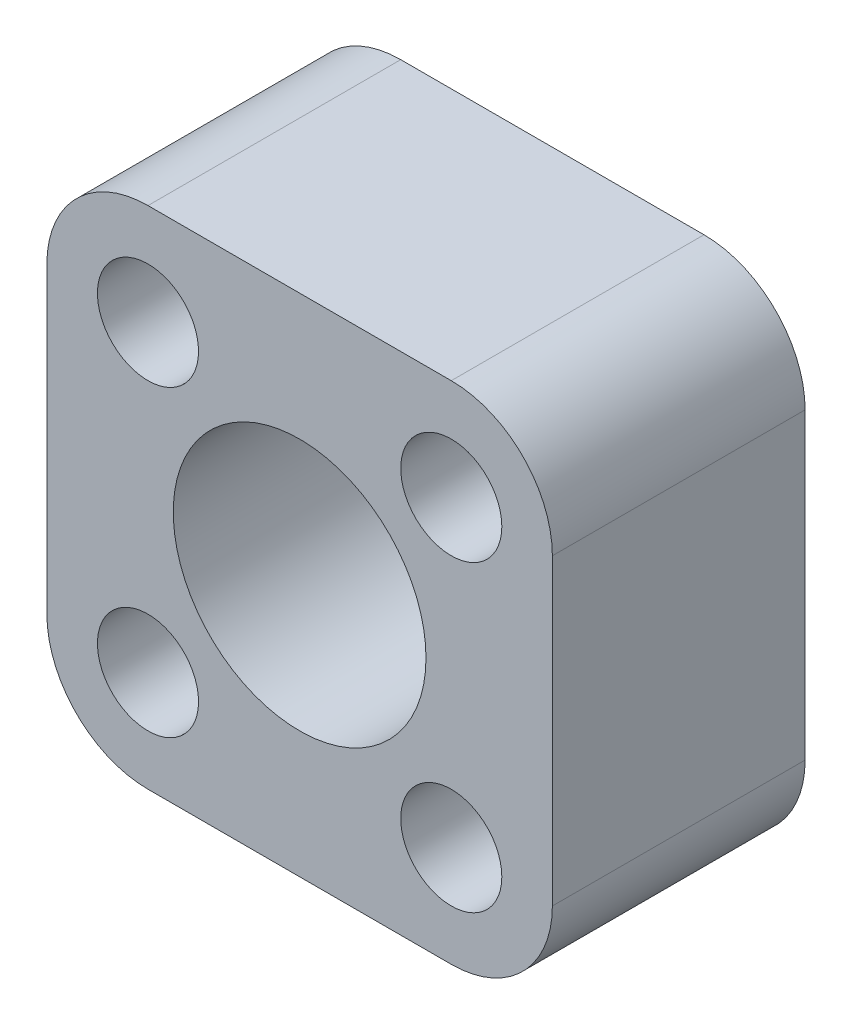
ISO-10303-21;
HEADER;
FILE_DESCRIPTION(('STEP AP214'),'2;1');
FILE_NAME('part.step','',(''),(''),'','','');
FILE_SCHEMA(('AUTOMOTIVE_DESIGN { 1 0 10303 214 1 1 1 1 }'));
ENDSEC;
DATA;
#1=APPLICATION_CONTEXT('core data for automotive mechanical design processes');
#2=APPLICATION_PROTOCOL_DEFINITION('international standard','automotive_design',2000,#1);
#3=PRODUCT_CONTEXT('',#1,'mechanical');
#4=PRODUCT('Part','Part','',(#3));
#5=PRODUCT_RELATED_PRODUCT_CATEGORY('part','',(#4));
#6=PRODUCT_DEFINITION_FORMATION('','',#4);
#7=PRODUCT_DEFINITION_CONTEXT('part definition',#1,'design');
#8=PRODUCT_DEFINITION('design','',#6,#7);
#9=PRODUCT_DEFINITION_SHAPE('','',#8);
#10=(LENGTH_UNIT() NAMED_UNIT(*) SI_UNIT(.MILLI.,.METRE.));
#11=(NAMED_UNIT(*) PLANE_ANGLE_UNIT() SI_UNIT($,.RADIAN.));
#12=(NAMED_UNIT(*) SI_UNIT($,.STERADIAN.) SOLID_ANGLE_UNIT());
#13=UNCERTAINTY_MEASURE_WITH_UNIT(LENGTH_MEASURE(1.E-05),#10,'distance_accuracy_value','');
#14=(GEOMETRIC_REPRESENTATION_CONTEXT(3) GLOBAL_UNCERTAINTY_ASSIGNED_CONTEXT((#13)) GLOBAL_UNIT_ASSIGNED_CONTEXT((#10,
#11,#12)) REPRESENTATION_CONTEXT('',''));
#15=CARTESIAN_POINT('',(0.,0.,0.));
#16=DIRECTION('',(0.,0.,1.));
#17=DIRECTION('',(1.,0.,0.));
#18=AXIS2_PLACEMENT_3D('',#15,#16,#17);
#19=CARTESIAN_POINT('',(3.,3.,5.));
#20=DIRECTION('',(0.,0.,-1.));
#21=DIRECTION('',(-1.,0.,0.));
#22=AXIS2_PLACEMENT_3D('',#19,#20,#21);
#23=PLANE('',#22);
#24=CARTESIAN_POINT('',(3.,3.,5.));
#25=DIRECTION('',(0.,0.,1.));
#26=DIRECTION('',(-1.,0.,0.));
#27=AXIS2_PLACEMENT_3D('',#24,#25,#26);
#28=CIRCLE('',#27,2.);
#29=CARTESIAN_POINT('',(5.,2.99999999999999,5.));
#30=VERTEX_POINT('',#29);
#31=CARTESIAN_POINT('',(2.99999999999999,5.,5.));
#32=VERTEX_POINT('',#31);
#33=EDGE_CURVE('E145',#30,#32,#28,.T.);
#34=ORIENTED_EDGE('',*,*,#33,.T.);
#35=DIRECTION('',(-1.,0.,0.));
#36=VECTOR('',#35,1.);
#37=CARTESIAN_POINT('',(-2.99999999999998,5.,5.));
#38=LINE('',#37,#36);
#39=CARTESIAN_POINT('',(-2.99999999999998,5.,5.));
#40=VERTEX_POINT('',#39);
#41=EDGE_CURVE('E93',#32,#40,#38,.T.);
#42=ORIENTED_EDGE('',*,*,#41,.T.);
#43=CARTESIAN_POINT('',(-3.,3.,5.));
#44=DIRECTION('',(0.,0.,1.));
#45=DIRECTION('',(1.,0.,0.));
#46=AXIS2_PLACEMENT_3D('',#43,#44,#45);
#47=CIRCLE('',#46,2.);
#48=CARTESIAN_POINT('',(-5.,2.99999999999999,5.));
#49=VERTEX_POINT('',#48);
#50=EDGE_CURVE('E160',#40,#49,#47,.T.);
#51=ORIENTED_EDGE('',*,*,#50,.T.);
#52=DIRECTION('',(0.,-1.,0.));
#53=VECTOR('',#52,1.);
#54=CARTESIAN_POINT('',(-5.,2.99999999999998,5.));
#55=LINE('',#54,#53);
#56=CARTESIAN_POINT('',(-5.,-2.99999999999999,5.));
#57=VERTEX_POINT('',#56);
#58=EDGE_CURVE('E173',#49,#57,#55,.T.);
#59=ORIENTED_EDGE('',*,*,#58,.T.);
#60=CARTESIAN_POINT('',(-3.,-3.,5.));
#61=DIRECTION('',(0.,0.,1.));
#62=DIRECTION('',(1.,0.,0.));
#63=AXIS2_PLACEMENT_3D('',#60,#61,#62);
#64=CIRCLE('',#63,2.);
#65=CARTESIAN_POINT('',(-2.99999999999998,-5.,5.));
#66=VERTEX_POINT('',#65);
#67=EDGE_CURVE('E112',#57,#66,#64,.T.);
#68=ORIENTED_EDGE('',*,*,#67,.T.);
#69=DIRECTION('',(1.,0.,0.));
#70=VECTOR('',#69,1.);
#71=CARTESIAN_POINT('',(-2.99999999999998,-5.,5.));
#72=LINE('',#71,#70);
#73=CARTESIAN_POINT('',(2.99999999999999,-5.,5.));
#74=VERTEX_POINT('',#73);
#75=EDGE_CURVE('E106',#66,#74,#72,.T.);
#76=ORIENTED_EDGE('',*,*,#75,.T.);
#77=CARTESIAN_POINT('',(3.,-3.,5.));
#78=DIRECTION('',(0.,0.,1.));
#79=DIRECTION('',(1.,0.,0.));
#80=AXIS2_PLACEMENT_3D('',#77,#78,#79);
#81=CIRCLE('',#80,2.);
#82=CARTESIAN_POINT('',(5.,-3.,5.));
#83=VERTEX_POINT('',#82);
#84=EDGE_CURVE('E110',#74,#83,#81,.T.);
#85=ORIENTED_EDGE('',*,*,#84,.T.);
#86=DIRECTION('',(0.,1.,0.));
#87=VECTOR('',#86,1.);
#88=CARTESIAN_POINT('',(5.,2.99999999999999,5.));
#89=LINE('',#88,#87);
#90=EDGE_CURVE('E50',#83,#30,#89,.T.);
#91=ORIENTED_EDGE('',*,*,#90,.T.);
#92=EDGE_LOOP('',(#34,#42,#51,#59,#68,#76,#85,#91));
#93=FACE_BOUND('',#92,.T.);
#94=CARTESIAN_POINT('',(-3.,3.,5.));
#95=DIRECTION('',(0.,0.,1.));
#96=DIRECTION('',(1.,0.,0.));
#97=AXIS2_PLACEMENT_3D('',#94,#95,#96);
#98=CIRCLE('',#97,1.);
#99=CARTESIAN_POINT('',(-2.,3.,5.));
#100=VERTEX_POINT('',#99);
#101=EDGE_CURVE('E134',#100,#100,#98,.T.);
#102=ORIENTED_EDGE('',*,*,#101,.F.);
#103=EDGE_LOOP('',(#102));
#104=FACE_BOUND('',#103,.T.);
#105=CARTESIAN_POINT('',(0.,0.,5.));
#106=DIRECTION('',(0.,0.,1.));
#107=DIRECTION('',(1.,0.,0.));
#108=AXIS2_PLACEMENT_3D('',#105,#106,#107);
#109=CIRCLE('',#108,2.5);
#110=CARTESIAN_POINT('',(2.5,0.,5.));
#111=VERTEX_POINT('',#110);
#112=EDGE_CURVE('E182',#111,#111,#109,.T.);
#113=ORIENTED_EDGE('',*,*,#112,.F.);
#114=EDGE_LOOP('',(#113));
#115=FACE_BOUND('',#114,.T.);
#116=CARTESIAN_POINT('',(3.,3.00000000000017,5.));
#117=DIRECTION('',(0.,0.,1.));
#118=DIRECTION('',(1.,0.,0.));
#119=AXIS2_PLACEMENT_3D('',#116,#117,#118);
#120=CIRCLE('',#119,1.00000000000017);
#121=CARTESIAN_POINT('',(4.00000000000017,3.00000000000017,5.));
#122=VERTEX_POINT('',#121);
#123=EDGE_CURVE('E188',#122,#122,#120,.T.);
#124=ORIENTED_EDGE('',*,*,#123,.F.);
#125=EDGE_LOOP('',(#124));
#126=FACE_BOUND('',#125,.T.);
#127=CARTESIAN_POINT('',(3.00000000000017,-2.99999999999983,5.));
#128=DIRECTION('',(0.,0.,1.));
#129=DIRECTION('',(1.,0.,0.));
#130=AXIS2_PLACEMENT_3D('',#127,#128,#129);
#131=CIRCLE('',#130,1.00000000000024);
#132=CARTESIAN_POINT('',(4.00000000000041,-2.99999999999983,5.));
#133=VERTEX_POINT('',#132);
#134=EDGE_CURVE('E194',#133,#133,#131,.T.);
#135=ORIENTED_EDGE('',*,*,#134,.F.);
#136=EDGE_LOOP('',(#135));
#137=FACE_BOUND('',#136,.T.);
#138=CARTESIAN_POINT('',(-2.99999999999983,-3.,5.));
#139=DIRECTION('',(0.,0.,1.));
#140=DIRECTION('',(1.,0.,0.));
#141=AXIS2_PLACEMENT_3D('',#138,#139,#140);
#142=CIRCLE('',#141,1.00000000000009);
#143=CARTESIAN_POINT('',(-1.99999999999974,-3.,5.));
#144=VERTEX_POINT('',#143);
#145=EDGE_CURVE('E200',#144,#144,#142,.T.);
#146=ORIENTED_EDGE('',*,*,#145,.F.);
#147=EDGE_LOOP('',(#146));
#148=FACE_BOUND('',#147,.T.);
#149=ADVANCED_FACE('F33',(#93,#104,#115,#126,#137,#148),#23,.F.);
#150=CARTESIAN_POINT('',(3.,3.,0.));
#151=DIRECTION('',(0.,0.,-1.));
#152=DIRECTION('',(-1.,0.,0.));
#153=AXIS2_PLACEMENT_3D('',#150,#151,#152);
#154=PLANE('',#153);
#155=CARTESIAN_POINT('',(3.00000000000017,-2.99999999999983,0.));
#156=DIRECTION('',(0.,0.,1.));
#157=DIRECTION('',(1.,0.,0.));
#158=AXIS2_PLACEMENT_3D('',#155,#156,#157);
#159=CIRCLE('',#158,1.00000000000024);
#160=CARTESIAN_POINT('',(4.00000000000041,-2.99999999999983,0.));
#161=VERTEX_POINT('',#160);
#162=EDGE_CURVE('E197',#161,#161,#159,.T.);
#163=ORIENTED_EDGE('',*,*,#162,.T.);
#164=EDGE_LOOP('',(#163));
#165=FACE_BOUND('',#164,.T.);
#166=CARTESIAN_POINT('',(0.,0.,0.));
#167=DIRECTION('',(0.,0.,1.));
#168=DIRECTION('',(1.,0.,0.));
#169=AXIS2_PLACEMENT_3D('',#166,#167,#168);
#170=CIRCLE('',#169,2.5);
#171=CARTESIAN_POINT('',(2.5,0.,0.));
#172=VERTEX_POINT('',#171);
#173=EDGE_CURVE('E185',#172,#172,#170,.T.);
#174=ORIENTED_EDGE('',*,*,#173,.T.);
#175=EDGE_LOOP('',(#174));
#176=FACE_BOUND('',#175,.T.);
#177=CARTESIAN_POINT('',(3.,3.,0.));
#178=DIRECTION('',(0.,0.,1.));
#179=DIRECTION('',(-1.,0.,0.));
#180=AXIS2_PLACEMENT_3D('',#177,#178,#179);
#181=CIRCLE('',#180,2.);
#182=CARTESIAN_POINT('',(5.,2.99999999999999,0.));
#183=VERTEX_POINT('',#182);
#184=CARTESIAN_POINT('',(2.99999999999999,5.,0.));
#185=VERTEX_POINT('',#184);
#186=EDGE_CURVE('E130',#183,#185,#181,.T.);
#187=ORIENTED_EDGE('',*,*,#186,.F.);
#188=DIRECTION('',(0.,1.,0.));
#189=VECTOR('',#188,1.);
#190=CARTESIAN_POINT('',(5.,2.99999999999999,0.));
#191=LINE('',#190,#189);
#192=CARTESIAN_POINT('',(5.,-3.,0.));
#193=VERTEX_POINT('',#192);
#194=EDGE_CURVE('E85',#193,#183,#191,.T.);
#195=ORIENTED_EDGE('',*,*,#194,.F.);
#196=CARTESIAN_POINT('',(3.,-3.,0.));
#197=DIRECTION('',(0.,0.,1.));
#198=DIRECTION('',(1.,0.,0.));
#199=AXIS2_PLACEMENT_3D('',#196,#197,#198);
#200=CIRCLE('',#199,2.);
#201=CARTESIAN_POINT('',(2.99999999999999,-5.,0.));
#202=VERTEX_POINT('',#201);
#203=EDGE_CURVE('E79',#202,#193,#200,.T.);
#204=ORIENTED_EDGE('',*,*,#203,.F.);
#205=DIRECTION('',(1.,0.,0.));
#206=VECTOR('',#205,1.);
#207=CARTESIAN_POINT('',(-2.99999999999998,-5.,0.));
#208=LINE('',#207,#206);
#209=CARTESIAN_POINT('',(-2.99999999999998,-5.,0.));
#210=VERTEX_POINT('',#209);
#211=EDGE_CURVE('E120',#210,#202,#208,.T.);
#212=ORIENTED_EDGE('',*,*,#211,.F.);
#213=CARTESIAN_POINT('',(-3.,-3.,0.));
#214=DIRECTION('',(0.,0.,1.));
#215=DIRECTION('',(1.,0.,0.));
#216=AXIS2_PLACEMENT_3D('',#213,#214,#215);
#217=CIRCLE('',#216,2.);
#218=CARTESIAN_POINT('',(-5.,-2.99999999999999,0.));
#219=VERTEX_POINT('',#218);
#220=EDGE_CURVE('E140',#219,#210,#217,.T.);
#221=ORIENTED_EDGE('',*,*,#220,.F.);
#222=DIRECTION('',(0.,-1.,0.));
#223=VECTOR('',#222,1.);
#224=CARTESIAN_POINT('',(-5.,2.99999999999998,0.));
#225=LINE('',#224,#223);
#226=CARTESIAN_POINT('',(-5.,2.99999999999999,0.));
#227=VERTEX_POINT('',#226);
#228=EDGE_CURVE('E138',#227,#219,#225,.T.);
#229=ORIENTED_EDGE('',*,*,#228,.F.);
#230=CARTESIAN_POINT('',(-3.,3.,0.));
#231=DIRECTION('',(0.,0.,1.));
#232=DIRECTION('',(1.,0.,0.));
#233=AXIS2_PLACEMENT_3D('',#230,#231,#232);
#234=CIRCLE('',#233,2.);
#235=CARTESIAN_POINT('',(-2.99999999999998,5.,0.));
#236=VERTEX_POINT('',#235);
#237=EDGE_CURVE('E136',#236,#227,#234,.T.);
#238=ORIENTED_EDGE('',*,*,#237,.F.);
#239=DIRECTION('',(-1.,0.,0.));
#240=VECTOR('',#239,1.);
#241=CARTESIAN_POINT('',(-2.99999999999998,5.,0.));
#242=LINE('',#241,#240);
#243=EDGE_CURVE('E133',#185,#236,#242,.T.);
#244=ORIENTED_EDGE('',*,*,#243,.F.);
#245=EDGE_LOOP('',(#187,#195,#204,#212,#221,#229,#238,#244));
#246=FACE_BOUND('',#245,.T.);
#247=CARTESIAN_POINT('',(-3.,3.,0.));
#248=DIRECTION('',(0.,0.,1.));
#249=DIRECTION('',(1.,0.,0.));
#250=AXIS2_PLACEMENT_3D('',#247,#248,#249);
#251=CIRCLE('',#250,1.);
#252=CARTESIAN_POINT('',(-2.,3.,0.));
#253=VERTEX_POINT('',#252);
#254=EDGE_CURVE('E179',#253,#253,#251,.T.);
#255=ORIENTED_EDGE('',*,*,#254,.T.);
#256=EDGE_LOOP('',(#255));
#257=FACE_BOUND('',#256,.T.);
#258=CARTESIAN_POINT('',(3.,3.00000000000017,0.));
#259=DIRECTION('',(0.,0.,1.));
#260=DIRECTION('',(1.,0.,0.));
#261=AXIS2_PLACEMENT_3D('',#258,#259,#260);
#262=CIRCLE('',#261,1.00000000000017);
#263=CARTESIAN_POINT('',(4.00000000000017,3.00000000000017,0.));
#264=VERTEX_POINT('',#263);
#265=EDGE_CURVE('E191',#264,#264,#262,.T.);
#266=ORIENTED_EDGE('',*,*,#265,.T.);
#267=EDGE_LOOP('',(#266));
#268=FACE_BOUND('',#267,.T.);
#269=CARTESIAN_POINT('',(-2.99999999999983,-3.,0.));
#270=DIRECTION('',(0.,0.,1.));
#271=DIRECTION('',(1.,0.,0.));
#272=AXIS2_PLACEMENT_3D('',#269,#270,#271);
#273=CIRCLE('',#272,1.00000000000009);
#274=CARTESIAN_POINT('',(-1.99999999999974,-3.,0.));
#275=VERTEX_POINT('',#274);
#276=EDGE_CURVE('E203',#275,#275,#273,.T.);
#277=ORIENTED_EDGE('',*,*,#276,.T.);
#278=EDGE_LOOP('',(#277));
#279=FACE_BOUND('',#278,.T.);
#280=ADVANCED_FACE('F164',(#165,#176,#246,#257,#268,#279),#154,.T.);
#281=CARTESIAN_POINT('',(3.,3.,5.));
#282=DIRECTION('',(0.,0.,-1.));
#283=DIRECTION('',(-1.,0.,0.));
#284=AXIS2_PLACEMENT_3D('',#281,#282,#283);
#285=CYLINDRICAL_SURFACE('',#284,2.);
#286=ORIENTED_EDGE('',*,*,#186,.T.);
#287=DIRECTION('',(0.,0.,-1.));
#288=VECTOR('',#287,1.);
#289=CARTESIAN_POINT('',(2.99999999999999,5.,5.));
#290=LINE('',#289,#288);
#291=EDGE_CURVE('E11',#32,#185,#290,.T.);
#292=ORIENTED_EDGE('',*,*,#291,.F.);
#293=ORIENTED_EDGE('',*,*,#33,.F.);
#294=DIRECTION('',(0.,0.,-1.));
#295=VECTOR('',#294,1.);
#296=CARTESIAN_POINT('',(5.,2.99999999999999,5.));
#297=LINE('',#296,#295);
#298=EDGE_CURVE('E126',#30,#183,#297,.T.);
#299=ORIENTED_EDGE('',*,*,#298,.T.);
#300=EDGE_LOOP('',(#286,#292,#293,#299));
#301=FACE_BOUND('',#300,.T.);
#302=ADVANCED_FACE('F35',(#301),#285,.T.);
#303=CARTESIAN_POINT('',(-2.99999999999998,5.,5.));
#304=DIRECTION('',(0.,-1.,0.));
#305=DIRECTION('',(0.,0.,-1.));
#306=AXIS2_PLACEMENT_3D('',#303,#304,#305);
#307=PLANE('',#306);
#308=ORIENTED_EDGE('',*,*,#243,.T.);
#309=DIRECTION('',(0.,0.,-1.));
#310=VECTOR('',#309,1.);
#311=CARTESIAN_POINT('',(-2.99999999999998,5.,5.));
#312=LINE('',#311,#310);
#313=EDGE_CURVE('E42',#40,#236,#312,.T.);
#314=ORIENTED_EDGE('',*,*,#313,.F.);
#315=ORIENTED_EDGE('',*,*,#41,.F.);
#316=ORIENTED_EDGE('',*,*,#291,.T.);
#317=EDGE_LOOP('',(#308,#314,#315,#316));
#318=FACE_BOUND('',#317,.T.);
#319=ADVANCED_FACE('F235',(#318),#307,.F.);
#320=CARTESIAN_POINT('',(-3.,3.,5.));
#321=DIRECTION('',(0.,0.,-1.));
#322=DIRECTION('',(-1.,0.,0.));
#323=AXIS2_PLACEMENT_3D('',#320,#321,#322);
#324=CYLINDRICAL_SURFACE('',#323,2.);
#325=ORIENTED_EDGE('',*,*,#237,.T.);
#326=DIRECTION('',(0.,0.,-1.));
#327=VECTOR('',#326,1.);
#328=CARTESIAN_POINT('',(-5.,2.99999999999999,5.));
#329=LINE('',#328,#327);
#330=EDGE_CURVE('E152',#49,#227,#329,.T.);
#331=ORIENTED_EDGE('',*,*,#330,.F.);
#332=ORIENTED_EDGE('',*,*,#50,.F.);
#333=ORIENTED_EDGE('',*,*,#313,.T.);
#334=EDGE_LOOP('',(#325,#331,#332,#333));
#335=FACE_BOUND('',#334,.T.);
#336=ADVANCED_FACE('F158',(#335),#324,.T.);
#337=CARTESIAN_POINT('',(-5.,2.99999999999998,5.));
#338=DIRECTION('',(1.,0.,0.));
#339=DIRECTION('',(0.,1.,0.));
#340=AXIS2_PLACEMENT_3D('',#337,#338,#339);
#341=PLANE('',#340);
#342=ORIENTED_EDGE('',*,*,#228,.T.);
#343=DIRECTION('',(0.,0.,-1.));
#344=VECTOR('',#343,1.);
#345=CARTESIAN_POINT('',(-5.,-2.99999999999999,5.));
#346=LINE('',#345,#344);
#347=EDGE_CURVE('E149',#57,#219,#346,.T.);
#348=ORIENTED_EDGE('',*,*,#347,.F.);
#349=ORIENTED_EDGE('',*,*,#58,.F.);
#350=ORIENTED_EDGE('',*,*,#330,.T.);
#351=EDGE_LOOP('',(#342,#348,#349,#350));
#352=FACE_BOUND('',#351,.T.);
#353=ADVANCED_FACE('F169',(#352),#341,.F.);
#354=CARTESIAN_POINT('',(-3.,-3.,5.));
#355=DIRECTION('',(0.,0.,-1.));
#356=DIRECTION('',(-1.,0.,0.));
#357=AXIS2_PLACEMENT_3D('',#354,#355,#356);
#358=CYLINDRICAL_SURFACE('',#357,2.);
#359=ORIENTED_EDGE('',*,*,#220,.T.);
#360=DIRECTION('',(0.,0.,-1.));
#361=VECTOR('',#360,1.);
#362=CARTESIAN_POINT('',(-2.99999999999998,-5.,5.));
#363=LINE('',#362,#361);
#364=EDGE_CURVE('E121',#66,#210,#363,.T.);
#365=ORIENTED_EDGE('',*,*,#364,.F.);
#366=ORIENTED_EDGE('',*,*,#67,.F.);
#367=ORIENTED_EDGE('',*,*,#347,.T.);
#368=EDGE_LOOP('',(#359,#365,#366,#367));
#369=FACE_BOUND('',#368,.T.);
#370=ADVANCED_FACE('F172',(#369),#358,.T.);
#371=CARTESIAN_POINT('',(-2.99999999999998,-5.,5.));
#372=DIRECTION('',(0.,1.,0.));
#373=DIRECTION('',(0.,0.,1.));
#374=AXIS2_PLACEMENT_3D('',#371,#372,#373);
#375=PLANE('',#374);
#376=ORIENTED_EDGE('',*,*,#211,.T.);
#377=DIRECTION('',(0.,0.,-1.));
#378=VECTOR('',#377,1.);
#379=CARTESIAN_POINT('',(2.99999999999999,-5.,5.));
#380=LINE('',#379,#378);
#381=EDGE_CURVE('E117',#74,#202,#380,.T.);
#382=ORIENTED_EDGE('',*,*,#381,.F.);
#383=ORIENTED_EDGE('',*,*,#75,.F.);
#384=ORIENTED_EDGE('',*,*,#364,.T.);
#385=EDGE_LOOP('',(#376,#382,#383,#384));
#386=FACE_BOUND('',#385,.T.);
#387=ADVANCED_FACE('F118',(#386),#375,.F.);
#388=CARTESIAN_POINT('',(3.,-3.,5.));
#389=DIRECTION('',(0.,0.,-1.));
#390=DIRECTION('',(-1.,0.,0.));
#391=AXIS2_PLACEMENT_3D('',#388,#389,#390);
#392=CYLINDRICAL_SURFACE('',#391,2.);
#393=ORIENTED_EDGE('',*,*,#203,.T.);
#394=DIRECTION('',(0.,0.,-1.));
#395=VECTOR('',#394,1.);
#396=CARTESIAN_POINT('',(5.,-3.,5.));
#397=LINE('',#396,#395);
#398=EDGE_CURVE('E122',#83,#193,#397,.T.);
#399=ORIENTED_EDGE('',*,*,#398,.F.);
#400=ORIENTED_EDGE('',*,*,#84,.F.);
#401=ORIENTED_EDGE('',*,*,#381,.T.);
#402=EDGE_LOOP('',(#393,#399,#400,#401));
#403=FACE_BOUND('',#402,.T.);
#404=ADVANCED_FACE('F124',(#403),#392,.T.);
#405=CARTESIAN_POINT('',(5.,2.99999999999999,5.));
#406=DIRECTION('',(-1.,0.,0.));
#407=DIRECTION('',(0.,-1.,0.));
#408=AXIS2_PLACEMENT_3D('',#405,#406,#407);
#409=PLANE('',#408);
#410=ORIENTED_EDGE('',*,*,#194,.T.);
#411=ORIENTED_EDGE('',*,*,#298,.F.);
#412=ORIENTED_EDGE('',*,*,#90,.F.);
#413=ORIENTED_EDGE('',*,*,#398,.T.);
#414=EDGE_LOOP('',(#410,#411,#412,#413));
#415=FACE_BOUND('',#414,.T.);
#416=ADVANCED_FACE('F223',(#415),#409,.F.);
#417=CARTESIAN_POINT('',(-3.,3.,5.));
#418=DIRECTION('',(0.,0.,-1.));
#419=DIRECTION('',(-1.,0.,0.));
#420=AXIS2_PLACEMENT_3D('',#417,#418,#419);
#421=CYLINDRICAL_SURFACE('',#420,1.);
#422=ORIENTED_EDGE('',*,*,#101,.T.);
#423=EDGE_LOOP('',(#422));
#424=FACE_BOUND('',#423,.T.);
#425=ORIENTED_EDGE('',*,*,#254,.F.);
#426=EDGE_LOOP('',(#425));
#427=FACE_BOUND('',#426,.T.);
#428=ADVANCED_FACE('F220',(#424,#427),#421,.F.);
#429=CARTESIAN_POINT('',(0.,0.,5.));
#430=DIRECTION('',(0.,0.,-1.));
#431=DIRECTION('',(-1.,0.,0.));
#432=AXIS2_PLACEMENT_3D('',#429,#430,#431);
#433=CYLINDRICAL_SURFACE('',#432,2.5);
#434=ORIENTED_EDGE('',*,*,#112,.T.);
#435=EDGE_LOOP('',(#434));
#436=FACE_BOUND('',#435,.T.);
#437=ORIENTED_EDGE('',*,*,#173,.F.);
#438=EDGE_LOOP('',(#437));
#439=FACE_BOUND('',#438,.T.);
#440=ADVANCED_FACE('F299',(#436,#439),#433,.F.);
#441=CARTESIAN_POINT('',(3.,3.00000000000017,5.));
#442=DIRECTION('',(0.,0.,-1.));
#443=DIRECTION('',(-1.,0.,0.));
#444=AXIS2_PLACEMENT_3D('',#441,#442,#443);
#445=CYLINDRICAL_SURFACE('',#444,1.00000000000017);
#446=ORIENTED_EDGE('',*,*,#123,.T.);
#447=EDGE_LOOP('',(#446));
#448=FACE_BOUND('',#447,.T.);
#449=ORIENTED_EDGE('',*,*,#265,.F.);
#450=EDGE_LOOP('',(#449));
#451=FACE_BOUND('',#450,.T.);
#452=ADVANCED_FACE('F307',(#448,#451),#445,.F.);
#453=CARTESIAN_POINT('',(3.00000000000017,-2.99999999999983,5.));
#454=DIRECTION('',(0.,0.,-1.));
#455=DIRECTION('',(-1.,0.,0.));
#456=AXIS2_PLACEMENT_3D('',#453,#454,#455);
#457=CYLINDRICAL_SURFACE('',#456,1.00000000000024);
#458=ORIENTED_EDGE('',*,*,#134,.T.);
#459=EDGE_LOOP('',(#458));
#460=FACE_BOUND('',#459,.T.);
#461=ORIENTED_EDGE('',*,*,#162,.F.);
#462=EDGE_LOOP('',(#461));
#463=FACE_BOUND('',#462,.T.);
#464=ADVANCED_FACE('F315',(#460,#463),#457,.F.);
#465=CARTESIAN_POINT('',(-2.99999999999983,-3.,5.));
#466=DIRECTION('',(0.,0.,-1.));
#467=DIRECTION('',(-1.,0.,0.));
#468=AXIS2_PLACEMENT_3D('',#465,#466,#467);
#469=CYLINDRICAL_SURFACE('',#468,1.00000000000009);
#470=ORIENTED_EDGE('',*,*,#145,.T.);
#471=EDGE_LOOP('',(#470));
#472=FACE_BOUND('',#471,.T.);
#473=ORIENTED_EDGE('',*,*,#276,.F.);
#474=EDGE_LOOP('',(#473));
#475=FACE_BOUND('',#474,.T.);
#476=ADVANCED_FACE('F209',(#472,#475),#469,.F.);
#477=CLOSED_SHELL('',(#149,#280,#302,#319,#336,#353,#370,#387,#404,#416,#428,#440,#452,#464,#476));
#478=MANIFOLD_SOLID_BREP('B2',#477);
#479=ADVANCED_BREP_SHAPE_REPRESENTATION('',(#18,#478),#14);
#480=SHAPE_DEFINITION_REPRESENTATION(#9,#479);
ENDSEC;
END-ISO-10303-21;
